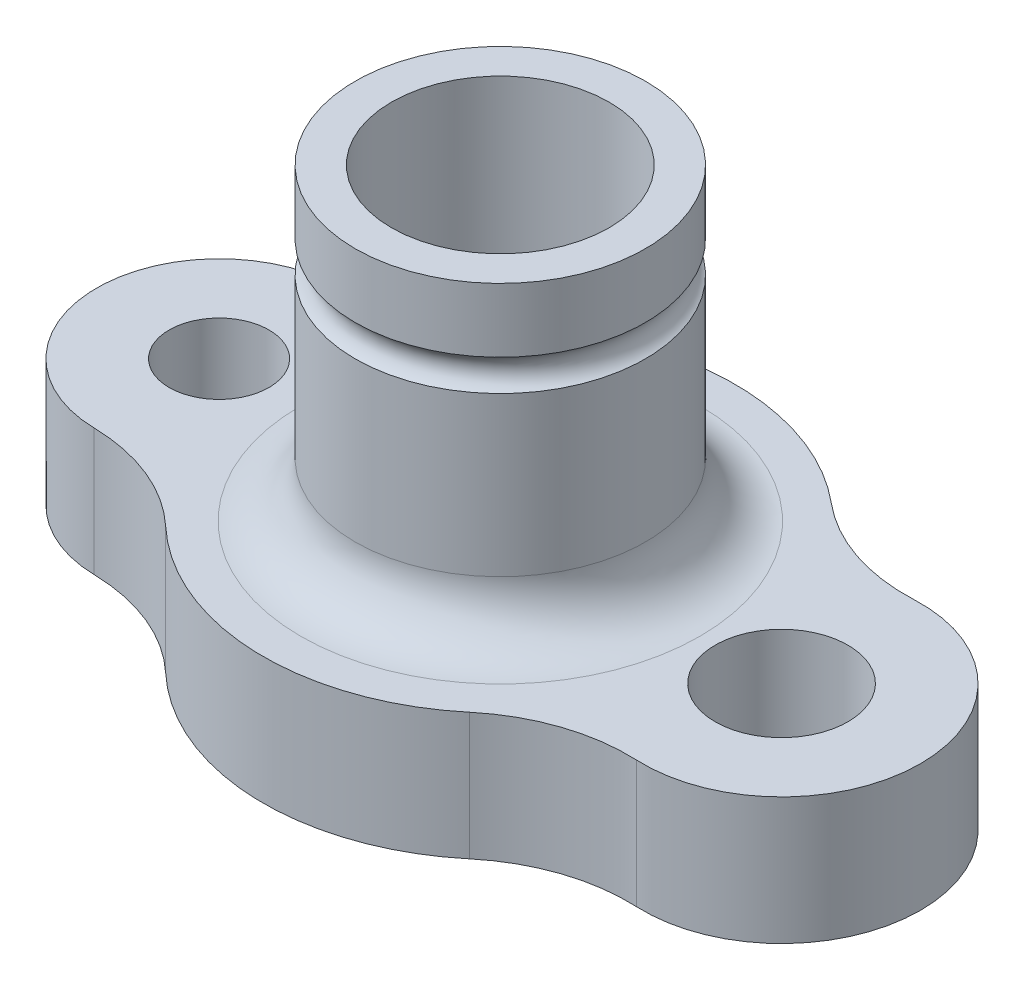
ISO-10303-21;
HEADER;
FILE_DESCRIPTION(('STEP AP214'),'2;1');
FILE_NAME('part.step','',(''),(''),'','','');
FILE_SCHEMA(('AUTOMOTIVE_DESIGN { 1 0 10303 214 1 1 1 1 }'));
ENDSEC;
DATA;
#1=APPLICATION_CONTEXT('core data for automotive mechanical design processes');
#2=APPLICATION_PROTOCOL_DEFINITION('international standard','automotive_design',2000,#1);
#3=PRODUCT_CONTEXT('',#1,'mechanical');
#4=PRODUCT('Part','Part','',(#3));
#5=PRODUCT_RELATED_PRODUCT_CATEGORY('part','',(#4));
#6=PRODUCT_DEFINITION_FORMATION('','',#4);
#7=PRODUCT_DEFINITION_CONTEXT('part definition',#1,'design');
#8=PRODUCT_DEFINITION('design','',#6,#7);
#9=PRODUCT_DEFINITION_SHAPE('','',#8);
#10=(LENGTH_UNIT() NAMED_UNIT(*) SI_UNIT(.MILLI.,.METRE.));
#11=(NAMED_UNIT(*) PLANE_ANGLE_UNIT() SI_UNIT($,.RADIAN.));
#12=(NAMED_UNIT(*) SI_UNIT($,.STERADIAN.) SOLID_ANGLE_UNIT());
#13=UNCERTAINTY_MEASURE_WITH_UNIT(LENGTH_MEASURE(1.E-05),#10,'distance_accuracy_value','');
#14=(GEOMETRIC_REPRESENTATION_CONTEXT(3) GLOBAL_UNCERTAINTY_ASSIGNED_CONTEXT((#13)) GLOBAL_UNIT_ASSIGNED_CONTEXT((#10,
#11,#12)) REPRESENTATION_CONTEXT('',''));
#15=CARTESIAN_POINT('',(0.,0.,0.));
#16=DIRECTION('',(0.,0.,1.));
#17=DIRECTION('',(1.,0.,0.));
#18=AXIS2_PLACEMENT_3D('',#15,#16,#17);
#19=CARTESIAN_POINT('',(0.,19.6088446071888,0.));
#20=DIRECTION('',(0.,-1.,0.));
#21=DIRECTION('',(0.,0.,-1.));
#22=AXIS2_PLACEMENT_3D('',#19,#20,#21);
#23=TOROIDAL_SURFACE('',#22,8.5,1.);
#24=CARTESIAN_POINT('',(0.,18.7428192034043,0.));
#25=DIRECTION('',(0.,1.,0.));
#26=DIRECTION('',(0.,0.,1.));
#27=AXIS2_PLACEMENT_3D('',#24,#25,#26);
#28=CIRCLE('',#27,8.);
#29=CARTESIAN_POINT('',(0.,18.7428192034043,8.));
#30=VERTEX_POINT('',#29);
#31=EDGE_CURVE('E11',#30,#30,#28,.F.);
#32=ORIENTED_EDGE('',*,*,#31,.F.);
#33=EDGE_LOOP('',(#32));
#34=FACE_BOUND('',#33,.T.);
#35=CARTESIAN_POINT('',(0.,20.4748700109732,0.));
#36=DIRECTION('',(0.,-1.,0.));
#37=DIRECTION('',(0.,0.,-1.));
#38=AXIS2_PLACEMENT_3D('',#35,#36,#37);
#39=CIRCLE('',#38,8.);
#40=CARTESIAN_POINT('',(0.,20.4748700109732,-8.));
#41=VERTEX_POINT('',#40);
#42=EDGE_CURVE('E48',#41,#41,#39,.F.);
#43=ORIENTED_EDGE('',*,*,#42,.F.);
#44=EDGE_LOOP('',(#43));
#45=FACE_BOUND('',#44,.T.);
#46=ADVANCED_FACE('F39',(#34,#45),#23,.F.);
#47=CARTESIAN_POINT('',(0.,7.,0.));
#48=DIRECTION('',(0.,-1.,0.));
#49=DIRECTION('',(0.,0.,-1.));
#50=AXIS2_PLACEMENT_3D('',#47,#48,#49);
#51=CYLINDRICAL_SURFACE('',#50,7.);
#52=CARTESIAN_POINT('',(0.,4.76393202250021,0.));
#53=DIRECTION('',(0.,1.,0.));
#54=DIRECTION('',(0.,0.,1.));
#55=AXIS2_PLACEMENT_3D('',#52,#53,#54);
#56=CIRCLE('',#55,7.);
#57=CARTESIAN_POINT('',(0.,4.76393202250021,7.));
#58=VERTEX_POINT('',#57);
#59=EDGE_CURVE('E187',#58,#58,#56,.T.);
#60=ORIENTED_EDGE('',*,*,#59,.T.);
#61=EDGE_LOOP('',(#60));
#62=FACE_BOUND('',#61,.T.);
#63=CARTESIAN_POINT('',(0.,0.,0.));
#64=DIRECTION('',(0.,1.,0.));
#65=DIRECTION('',(0.,0.,1.));
#66=AXIS2_PLACEMENT_3D('',#63,#64,#65);
#67=CIRCLE('',#66,7.);
#68=CARTESIAN_POINT('',(0.,0.,7.));
#69=VERTEX_POINT('',#68);
#70=EDGE_CURVE('E147',#69,#69,#67,.T.);
#71=ORIENTED_EDGE('',*,*,#70,.F.);
#72=EDGE_LOOP('',(#71));
#73=FACE_BOUND('',#72,.T.);
#74=ADVANCED_FACE('F214',(#62,#73),#51,.F.);
#75=CARTESIAN_POINT('',(0.,4.76393202250021,0.));
#76=DIRECTION('',(0.,1.,0.));
#77=DIRECTION('',(0.,0.,1.));
#78=AXIS2_PLACEMENT_3D('',#75,#76,#77);
#79=TOROIDAL_SURFACE('',#78,4.,3.);
#80=CARTESIAN_POINT('',(0.,6.42224441767791,0.));
#81=DIRECTION('',(0.,-1.,0.));
#82=DIRECTION('',(0.,0.,-1.));
#83=AXIS2_PLACEMENT_3D('',#80,#81,#82);
#84=CIRCLE('',#83,6.5);
#85=CARTESIAN_POINT('',(0.,6.42224441767791,-6.5));
#86=VERTEX_POINT('',#85);
#87=EDGE_CURVE('E199',#86,#86,#84,.F.);
#88=ORIENTED_EDGE('',*,*,#87,.T.);
#89=EDGE_LOOP('',(#88));
#90=FACE_BOUND('',#89,.T.);
#91=ORIENTED_EDGE('',*,*,#59,.F.);
#92=EDGE_LOOP('',(#91));
#93=FACE_BOUND('',#92,.T.);
#94=ADVANCED_FACE('F220',(#90,#93),#79,.F.);
#95=CARTESIAN_POINT('',(0.,8.08055681285561,0.));
#96=DIRECTION('',(0.,-1.,0.));
#97=DIRECTION('',(0.,0.,-1.));
#98=AXIS2_PLACEMENT_3D('',#95,#96,#97);
#99=TOROIDAL_SURFACE('',#98,9.,3.);
#100=CARTESIAN_POINT('',(0.,8.08055681285561,0.));
#101=DIRECTION('',(0.,-1.,0.));
#102=DIRECTION('',(0.,0.,-1.));
#103=AXIS2_PLACEMENT_3D('',#100,#101,#102);
#104=CIRCLE('',#103,6.);
#105=CARTESIAN_POINT('',(0.,8.08055681285561,-6.));
#106=VERTEX_POINT('',#105);
#107=EDGE_CURVE('E203',#106,#106,#104,.T.);
#108=ORIENTED_EDGE('',*,*,#107,.F.);
#109=EDGE_LOOP('',(#108));
#110=FACE_BOUND('',#109,.T.);
#111=ORIENTED_EDGE('',*,*,#87,.F.);
#112=EDGE_LOOP('',(#111));
#113=FACE_BOUND('',#112,.T.);
#114=ADVANCED_FACE('F251',(#110,#113),#99,.T.);
#115=CARTESIAN_POINT('',(0.,24.,0.));
#116=DIRECTION('',(0.,-1.,0.));
#117=DIRECTION('',(0.,0.,-1.));
#118=AXIS2_PLACEMENT_3D('',#115,#116,#117);
#119=CYLINDRICAL_SURFACE('',#118,6.);
#120=ORIENTED_EDGE('',*,*,#107,.T.);
#121=EDGE_LOOP('',(#120));
#122=FACE_BOUND('',#121,.T.);
#123=CARTESIAN_POINT('',(0.,24.,0.));
#124=DIRECTION('',(0.,1.,0.));
#125=DIRECTION('',(0.,0.,1.));
#126=AXIS2_PLACEMENT_3D('',#123,#124,#125);
#127=CIRCLE('',#126,6.);
#128=CARTESIAN_POINT('',(0.,24.,6.));
#129=VERTEX_POINT('',#128);
#130=EDGE_CURVE('E260',#129,#129,#127,.T.);
#131=ORIENTED_EDGE('',*,*,#130,.T.);
#132=EDGE_LOOP('',(#131));
#133=FACE_BOUND('',#132,.T.);
#134=ADVANCED_FACE('F246',(#122,#133),#119,.F.);
#135=CARTESIAN_POINT('',(0.,24.,0.));
#136=DIRECTION('',(0.,1.,0.));
#137=DIRECTION('',(0.,0.,1.));
#138=AXIS2_PLACEMENT_3D('',#135,#136,#137);
#139=PLANE('',#138);
#140=CARTESIAN_POINT('',(0.,24.,0.));
#141=DIRECTION('',(0.,1.,0.));
#142=DIRECTION('',(0.,0.,1.));
#143=AXIS2_PLACEMENT_3D('',#140,#141,#142);
#144=CIRCLE('',#143,8.);
#145=CARTESIAN_POINT('',(0.,24.,8.));
#146=VERTEX_POINT('',#145);
#147=EDGE_CURVE('E257',#146,#146,#144,.T.);
#148=ORIENTED_EDGE('',*,*,#147,.T.);
#149=EDGE_LOOP('',(#148));
#150=FACE_BOUND('',#149,.T.);
#151=ORIENTED_EDGE('',*,*,#130,.F.);
#152=EDGE_LOOP('',(#151));
#153=FACE_BOUND('',#152,.T.);
#154=ADVANCED_FACE('F238',(#150,#153),#139,.T.);
#155=CARTESIAN_POINT('',(0.,24.,0.));
#156=DIRECTION('',(0.,-1.,0.));
#157=DIRECTION('',(0.,0.,-1.));
#158=AXIS2_PLACEMENT_3D('',#155,#156,#157);
#159=CYLINDRICAL_SURFACE('',#158,8.);
#160=ORIENTED_EDGE('',*,*,#42,.T.);
#161=EDGE_LOOP('',(#160));
#162=FACE_BOUND('',#161,.T.);
#163=ORIENTED_EDGE('',*,*,#147,.F.);
#164=EDGE_LOOP('',(#163));
#165=FACE_BOUND('',#164,.T.);
#166=ADVANCED_FACE('F210',(#162,#165),#159,.T.);
#167=CARTESIAN_POINT('',(-15.6666732992892,0.,8.37334132896206));
#168=DIRECTION('',(0.,1.,0.));
#169=DIRECTION('',(0.,0.,1.));
#170=AXIS2_PLACEMENT_3D('',#167,#168,#169);
#171=PLANE('',#170);
#172=CARTESIAN_POINT('',(-15.8333465985785,0.,16.7466826579241));
#173=DIRECTION('',(0.,-1.,0.));
#174=DIRECTION('',(0.,0.,1.));
#175=AXIS2_PLACEMENT_3D('',#172,#173,#174);
#176=CIRCLE('',#175,10.);
#177=CARTESIAN_POINT('',(-15.6343337039048,0.,6.74866316065599));
#178=VERTEX_POINT('',#177);
#179=CARTESIAN_POINT('',(-8.97881406538982,0.,9.46551628491364));
#180=VERTEX_POINT('',#179);
#181=EDGE_CURVE('E142',#178,#180,#176,.T.);
#182=ORIENTED_EDGE('',*,*,#181,.F.);
#183=CARTESIAN_POINT('',(-15.5,0.,0.));
#184=DIRECTION('',(0.,1.,0.));
#185=DIRECTION('',(0.,0.,1.));
#186=AXIS2_PLACEMENT_3D('',#183,#184,#185);
#187=CIRCLE('',#186,6.75);
#188=CARTESIAN_POINT('',(-15.6343337039047,0.,-6.74866316065598));
#189=VERTEX_POINT('',#188);
#190=EDGE_CURVE('E91',#189,#178,#187,.T.);
#191=ORIENTED_EDGE('',*,*,#190,.F.);
#192=CARTESIAN_POINT('',(-15.8333465985785,0.,-16.7466826579241));
#193=DIRECTION('',(0.,-1.,0.));
#194=DIRECTION('',(0.,0.,-1.));
#195=AXIS2_PLACEMENT_3D('',#192,#193,#194);
#196=CIRCLE('',#195,10.);
#197=CARTESIAN_POINT('',(-8.97881406538982,0.,-9.46551628491363));
#198=VERTEX_POINT('',#197);
#199=EDGE_CURVE('E85',#198,#189,#196,.T.);
#200=ORIENTED_EDGE('',*,*,#199,.F.);
#201=CARTESIAN_POINT('',(-0.0679217722446071,0.,0.));
#202=DIRECTION('',(0.,1.,0.));
#203=DIRECTION('',(0.,0.,1.));
#204=AXIS2_PLACEMENT_3D('',#201,#202,#203);
#205=CIRCLE('',#204,13.);
#206=CARTESIAN_POINT('',(8.27332084725442,0.,-9.97114193874768));
#207=VERTEX_POINT('',#206);
#208=EDGE_CURVE('E129',#207,#198,#205,.T.);
#209=ORIENTED_EDGE('',*,*,#208,.F.);
#210=CARTESIAN_POINT('',(14.6896613237921,0.,-17.6412511223997));
#211=DIRECTION('',(0.,-1.,0.));
#212=DIRECTION('',(0.,0.,-1.));
#213=AXIS2_PLACEMENT_3D('',#210,#211,#212);
#214=CIRCLE('',#213,10.);
#215=CARTESIAN_POINT('',(15.148520579107,0.,-7.65178426055912));
#216=VERTEX_POINT('',#215);
#217=EDGE_CURVE('E156',#216,#207,#214,.T.);
#218=ORIENTED_EDGE('',*,*,#217,.F.);
#219=CARTESIAN_POINT('',(15.5,0.,0.));
#220=DIRECTION('',(0.,1.,0.));
#221=DIRECTION('',(0.,0.,1.));
#222=AXIS2_PLACEMENT_3D('',#219,#220,#221);
#223=CIRCLE('',#222,7.65985248901384);
#224=CARTESIAN_POINT('',(15.148520579107,0.,7.65178426055911));
#225=VERTEX_POINT('',#224);
#226=EDGE_CURVE('E153',#225,#216,#223,.T.);
#227=ORIENTED_EDGE('',*,*,#226,.F.);
#228=CARTESIAN_POINT('',(14.6896613237922,0.,17.6412511223997));
#229=DIRECTION('',(0.,-1.,0.));
#230=DIRECTION('',(0.,0.,-1.));
#231=AXIS2_PLACEMENT_3D('',#228,#229,#230);
#232=CIRCLE('',#231,10.);
#233=CARTESIAN_POINT('',(8.27332084725444,0.,9.97114193874768));
#234=VERTEX_POINT('',#233);
#235=EDGE_CURVE('E150',#234,#225,#232,.T.);
#236=ORIENTED_EDGE('',*,*,#235,.F.);
#237=CARTESIAN_POINT('',(-0.0679217722446071,0.,0.));
#238=DIRECTION('',(0.,1.,0.));
#239=DIRECTION('',(0.,0.,1.));
#240=AXIS2_PLACEMENT_3D('',#237,#238,#239);
#241=CIRCLE('',#240,13.);
#242=EDGE_CURVE('E146',#180,#234,#241,.T.);
#243=ORIENTED_EDGE('',*,*,#242,.F.);
#244=EDGE_LOOP('',(#182,#191,#200,#209,#218,#227,#236,#243));
#245=FACE_BOUND('',#244,.T.);
#246=ORIENTED_EDGE('',*,*,#70,.T.);
#247=EDGE_LOOP('',(#246));
#248=FACE_BOUND('',#247,.T.);
#249=CARTESIAN_POINT('',(-15.5,0.,0.));
#250=DIRECTION('',(0.,1.,0.));
#251=DIRECTION('',(0.,0.,1.));
#252=AXIS2_PLACEMENT_3D('',#249,#250,#251);
#253=CIRCLE('',#252,2.75);
#254=CARTESIAN_POINT('',(-15.5,0.,2.75));
#255=VERTEX_POINT('',#254);
#256=EDGE_CURVE('E272',#255,#255,#253,.T.);
#257=ORIENTED_EDGE('',*,*,#256,.T.);
#258=EDGE_LOOP('',(#257));
#259=FACE_BOUND('',#258,.T.);
#260=CARTESIAN_POINT('',(15.5,0.,0.));
#261=DIRECTION('',(0.,1.,0.));
#262=DIRECTION('',(0.,0.,1.));
#263=AXIS2_PLACEMENT_3D('',#260,#261,#262);
#264=CIRCLE('',#263,3.65985248901384);
#265=CARTESIAN_POINT('',(15.5,0.,3.65985248901384));
#266=VERTEX_POINT('',#265);
#267=EDGE_CURVE('E265',#266,#266,#264,.T.);
#268=ORIENTED_EDGE('',*,*,#267,.T.);
#269=EDGE_LOOP('',(#268));
#270=FACE_BOUND('',#269,.T.);
#271=ADVANCED_FACE('F237',(#245,#248,#259,#270),#171,.F.);
#272=CARTESIAN_POINT('',(15.5,7.,0.));
#273=DIRECTION('',(0.,-1.,0.));
#274=DIRECTION('',(0.,0.,-1.));
#275=AXIS2_PLACEMENT_3D('',#272,#273,#274);
#276=CYLINDRICAL_SURFACE('',#275,3.65985248901384);
#277=CARTESIAN_POINT('',(15.5,7.,0.));
#278=DIRECTION('',(0.,1.,0.));
#279=DIRECTION('',(0.,0.,1.));
#280=AXIS2_PLACEMENT_3D('',#277,#278,#279);
#281=CIRCLE('',#280,3.65985248901384);
#282=CARTESIAN_POINT('',(15.5,7.,3.65985248901384));
#283=VERTEX_POINT('',#282);
#284=EDGE_CURVE('E268',#283,#283,#281,.T.);
#285=ORIENTED_EDGE('',*,*,#284,.T.);
#286=EDGE_LOOP('',(#285));
#287=FACE_BOUND('',#286,.T.);
#288=ORIENTED_EDGE('',*,*,#267,.F.);
#289=EDGE_LOOP('',(#288));
#290=FACE_BOUND('',#289,.T.);
#291=ADVANCED_FACE('F243',(#287,#290),#276,.F.);
#292=CARTESIAN_POINT('',(-15.5,7.,0.));
#293=DIRECTION('',(0.,-1.,0.));
#294=DIRECTION('',(0.,0.,-1.));
#295=AXIS2_PLACEMENT_3D('',#292,#293,#294);
#296=CYLINDRICAL_SURFACE('',#295,6.75);
#297=ORIENTED_EDGE('',*,*,#190,.T.);
#298=DIRECTION('',(0.,-1.,0.));
#299=VECTOR('',#298,1.);
#300=CARTESIAN_POINT('',(-15.6343337039048,7.,6.74866316065599));
#301=LINE('',#300,#299);
#302=CARTESIAN_POINT('',(-15.6343337039048,7.,6.74866316065599));
#303=VERTEX_POINT('',#302);
#304=EDGE_CURVE('E138',#303,#178,#301,.T.);
#305=ORIENTED_EDGE('',*,*,#304,.F.);
#306=CARTESIAN_POINT('',(-15.5,7.,0.));
#307=DIRECTION('',(0.,1.,0.));
#308=DIRECTION('',(0.,0.,1.));
#309=AXIS2_PLACEMENT_3D('',#306,#307,#308);
#310=CIRCLE('',#309,6.75);
#311=CARTESIAN_POINT('',(-15.6343337039047,7.,-6.74866316065598));
#312=VERTEX_POINT('',#311);
#313=EDGE_CURVE('E56',#312,#303,#310,.T.);
#314=ORIENTED_EDGE('',*,*,#313,.F.);
#315=DIRECTION('',(0.,-1.,0.));
#316=VECTOR('',#315,1.);
#317=CARTESIAN_POINT('',(-15.6343337039047,7.,-6.74866316065598));
#318=LINE('',#317,#316);
#319=EDGE_CURVE('E132',#312,#189,#318,.T.);
#320=ORIENTED_EDGE('',*,*,#319,.T.);
#321=EDGE_LOOP('',(#297,#305,#314,#320));
#322=FACE_BOUND('',#321,.T.);
#323=ADVANCED_FACE('F313',(#322),#296,.T.);
#324=CARTESIAN_POINT('',(-15.8333465985785,7.,-16.7466826579241));
#325=DIRECTION('',(0.,-1.,0.));
#326=DIRECTION('',(0.,0.,-1.));
#327=AXIS2_PLACEMENT_3D('',#324,#325,#326);
#328=CYLINDRICAL_SURFACE('',#327,10.);
#329=ORIENTED_EDGE('',*,*,#199,.T.);
#330=ORIENTED_EDGE('',*,*,#319,.F.);
#331=CARTESIAN_POINT('',(-15.8333465985785,7.,-16.7466826579241));
#332=DIRECTION('',(0.,-1.,0.));
#333=DIRECTION('',(0.,0.,-1.));
#334=AXIS2_PLACEMENT_3D('',#331,#332,#333);
#335=CIRCLE('',#334,10.);
#336=CARTESIAN_POINT('',(-8.97881406538982,7.,-9.46551628491363));
#337=VERTEX_POINT('',#336);
#338=EDGE_CURVE('E118',#337,#312,#335,.T.);
#339=ORIENTED_EDGE('',*,*,#338,.F.);
#340=DIRECTION('',(0.,-1.,0.));
#341=VECTOR('',#340,1.);
#342=CARTESIAN_POINT('',(-8.97881406538982,7.,-9.46551628491363));
#343=LINE('',#342,#341);
#344=EDGE_CURVE('E126',#337,#198,#343,.T.);
#345=ORIENTED_EDGE('',*,*,#344,.T.);
#346=EDGE_LOOP('',(#329,#330,#339,#345));
#347=FACE_BOUND('',#346,.T.);
#348=ADVANCED_FACE('F134',(#347),#328,.F.);
#349=CARTESIAN_POINT('',(-0.0679217722446071,7.,0.));
#350=DIRECTION('',(0.,-1.,0.));
#351=DIRECTION('',(0.,0.,-1.));
#352=AXIS2_PLACEMENT_3D('',#349,#350,#351);
#353=CYLINDRICAL_SURFACE('',#352,13.);
#354=ORIENTED_EDGE('',*,*,#208,.T.);
#355=ORIENTED_EDGE('',*,*,#344,.F.);
#356=CARTESIAN_POINT('',(-0.0679217722446071,7.,0.));
#357=DIRECTION('',(0.,1.,0.));
#358=DIRECTION('',(0.,0.,1.));
#359=AXIS2_PLACEMENT_3D('',#356,#357,#358);
#360=CIRCLE('',#359,13.);
#361=CARTESIAN_POINT('',(8.27332084725442,7.,-9.97114193874768));
#362=VERTEX_POINT('',#361);
#363=EDGE_CURVE('E113',#362,#337,#360,.T.);
#364=ORIENTED_EDGE('',*,*,#363,.F.);
#365=DIRECTION('',(0.,-1.,0.));
#366=VECTOR('',#365,1.);
#367=CARTESIAN_POINT('',(8.27332084725442,7.,-9.97114193874768));
#368=LINE('',#367,#366);
#369=EDGE_CURVE('E131',#362,#207,#368,.T.);
#370=ORIENTED_EDGE('',*,*,#369,.T.);
#371=EDGE_LOOP('',(#354,#355,#364,#370));
#372=FACE_BOUND('',#371,.T.);
#373=ADVANCED_FACE('F127',(#372),#353,.T.);
#374=CARTESIAN_POINT('',(14.6896613237921,7.,-17.6412511223997));
#375=DIRECTION('',(0.,-1.,0.));
#376=DIRECTION('',(0.,0.,-1.));
#377=AXIS2_PLACEMENT_3D('',#374,#375,#376);
#378=CYLINDRICAL_SURFACE('',#377,10.);
#379=ORIENTED_EDGE('',*,*,#217,.T.);
#380=ORIENTED_EDGE('',*,*,#369,.F.);
#381=CARTESIAN_POINT('',(14.6896613237921,7.,-17.6412511223997));
#382=DIRECTION('',(0.,-1.,0.));
#383=DIRECTION('',(0.,0.,-1.));
#384=AXIS2_PLACEMENT_3D('',#381,#382,#383);
#385=CIRCLE('',#384,10.);
#386=CARTESIAN_POINT('',(15.148520579107,7.,-7.65178426055912));
#387=VERTEX_POINT('',#386);
#388=EDGE_CURVE('E120',#387,#362,#385,.T.);
#389=ORIENTED_EDGE('',*,*,#388,.F.);
#390=DIRECTION('',(0.,-1.,0.));
#391=VECTOR('',#390,1.);
#392=CARTESIAN_POINT('',(15.148520579107,7.,-7.65178426055912));
#393=LINE('',#392,#391);
#394=EDGE_CURVE('E172',#387,#216,#393,.T.);
#395=ORIENTED_EDGE('',*,*,#394,.T.);
#396=EDGE_LOOP('',(#379,#380,#389,#395));
#397=FACE_BOUND('',#396,.T.);
#398=ADVANCED_FACE('F305',(#397),#378,.F.);
#399=CARTESIAN_POINT('',(15.5,7.,0.));
#400=DIRECTION('',(0.,-1.,0.));
#401=DIRECTION('',(0.,0.,-1.));
#402=AXIS2_PLACEMENT_3D('',#399,#400,#401);
#403=CYLINDRICAL_SURFACE('',#402,7.65985248901384);
#404=ORIENTED_EDGE('',*,*,#226,.T.);
#405=ORIENTED_EDGE('',*,*,#394,.F.);
#406=CARTESIAN_POINT('',(15.5,7.,0.));
#407=DIRECTION('',(0.,1.,0.));
#408=DIRECTION('',(0.,0.,1.));
#409=AXIS2_PLACEMENT_3D('',#406,#407,#408);
#410=CIRCLE('',#409,7.65985248901384);
#411=CARTESIAN_POINT('',(15.148520579107,7.,7.65178426055911));
#412=VERTEX_POINT('',#411);
#413=EDGE_CURVE('E293',#412,#387,#410,.T.);
#414=ORIENTED_EDGE('',*,*,#413,.F.);
#415=DIRECTION('',(0.,-1.,0.));
#416=VECTOR('',#415,1.);
#417=CARTESIAN_POINT('',(15.148520579107,7.,7.65178426055911));
#418=LINE('',#417,#416);
#419=EDGE_CURVE('E176',#412,#225,#418,.T.);
#420=ORIENTED_EDGE('',*,*,#419,.T.);
#421=EDGE_LOOP('',(#404,#405,#414,#420));
#422=FACE_BOUND('',#421,.T.);
#423=ADVANCED_FACE('F301',(#422),#403,.T.);
#424=CARTESIAN_POINT('',(14.6896613237922,7.,17.6412511223997));
#425=DIRECTION('',(0.,-1.,0.));
#426=DIRECTION('',(0.,0.,-1.));
#427=AXIS2_PLACEMENT_3D('',#424,#425,#426);
#428=CYLINDRICAL_SURFACE('',#427,10.);
#429=ORIENTED_EDGE('',*,*,#235,.T.);
#430=ORIENTED_EDGE('',*,*,#419,.F.);
#431=CARTESIAN_POINT('',(14.6896613237922,7.,17.6412511223997));
#432=DIRECTION('',(0.,-1.,0.));
#433=DIRECTION('',(0.,0.,-1.));
#434=AXIS2_PLACEMENT_3D('',#431,#432,#433);
#435=CIRCLE('',#434,10.);
#436=CARTESIAN_POINT('',(8.27332084725444,7.,9.97114193874768));
#437=VERTEX_POINT('',#436);
#438=EDGE_CURVE('E290',#437,#412,#435,.T.);
#439=ORIENTED_EDGE('',*,*,#438,.F.);
#440=DIRECTION('',(0.,-1.,0.));
#441=VECTOR('',#440,1.);
#442=CARTESIAN_POINT('',(8.27332084725444,7.,9.97114193874768));
#443=LINE('',#442,#441);
#444=EDGE_CURVE('E180',#437,#234,#443,.T.);
#445=ORIENTED_EDGE('',*,*,#444,.T.);
#446=EDGE_LOOP('',(#429,#430,#439,#445));
#447=FACE_BOUND('',#446,.T.);
#448=ADVANCED_FACE('F330',(#447),#428,.F.);
#449=CARTESIAN_POINT('',(-0.0679217722446071,7.,0.));
#450=DIRECTION('',(0.,-1.,0.));
#451=DIRECTION('',(0.,0.,-1.));
#452=AXIS2_PLACEMENT_3D('',#449,#450,#451);
#453=CYLINDRICAL_SURFACE('',#452,13.);
#454=ORIENTED_EDGE('',*,*,#242,.T.);
#455=ORIENTED_EDGE('',*,*,#444,.F.);
#456=CARTESIAN_POINT('',(-0.0679217722446071,7.,0.));
#457=DIRECTION('',(0.,1.,0.));
#458=DIRECTION('',(0.,0.,1.));
#459=AXIS2_PLACEMENT_3D('',#456,#457,#458);
#460=CIRCLE('',#459,13.);
#461=CARTESIAN_POINT('',(-8.97881406538982,7.,9.46551628491364));
#462=VERTEX_POINT('',#461);
#463=EDGE_CURVE('E100',#462,#437,#460,.T.);
#464=ORIENTED_EDGE('',*,*,#463,.F.);
#465=DIRECTION('',(0.,-1.,0.));
#466=VECTOR('',#465,1.);
#467=CARTESIAN_POINT('',(-8.97881406538982,7.,9.46551628491364));
#468=LINE('',#467,#466);
#469=EDGE_CURVE('E184',#462,#180,#468,.T.);
#470=ORIENTED_EDGE('',*,*,#469,.T.);
#471=EDGE_LOOP('',(#454,#455,#464,#470));
#472=FACE_BOUND('',#471,.T.);
#473=ADVANCED_FACE('F333',(#472),#453,.T.);
#474=CARTESIAN_POINT('',(-15.8333465985785,7.,16.7466826579241));
#475=DIRECTION('',(0.,-1.,0.));
#476=DIRECTION('',(0.,0.,-1.));
#477=AXIS2_PLACEMENT_3D('',#474,#475,#476);
#478=CYLINDRICAL_SURFACE('',#477,10.);
#479=ORIENTED_EDGE('',*,*,#181,.T.);
#480=ORIENTED_EDGE('',*,*,#469,.F.);
#481=CARTESIAN_POINT('',(-15.8333465985785,7.,16.7466826579241));
#482=DIRECTION('',(0.,-1.,0.));
#483=DIRECTION('',(0.,0.,1.));
#484=AXIS2_PLACEMENT_3D('',#481,#482,#483);
#485=CIRCLE('',#484,10.);
#486=EDGE_CURVE('E165',#303,#462,#485,.T.);
#487=ORIENTED_EDGE('',*,*,#486,.F.);
#488=ORIENTED_EDGE('',*,*,#304,.T.);
#489=EDGE_LOOP('',(#479,#480,#487,#488));
#490=FACE_BOUND('',#489,.T.);
#491=ADVANCED_FACE('F311',(#490),#478,.F.);
#492=CARTESIAN_POINT('',(-15.5,7.,0.));
#493=DIRECTION('',(0.,-1.,0.));
#494=DIRECTION('',(0.,0.,-1.));
#495=AXIS2_PLACEMENT_3D('',#492,#493,#494);
#496=CYLINDRICAL_SURFACE('',#495,2.75);
#497=CARTESIAN_POINT('',(-15.5,7.,0.));
#498=DIRECTION('',(0.,1.,0.));
#499=DIRECTION('',(0.,0.,1.));
#500=AXIS2_PLACEMENT_3D('',#497,#498,#499);
#501=CIRCLE('',#500,2.75);
#502=CARTESIAN_POINT('',(-15.5,7.,2.75));
#503=VERTEX_POINT('',#502);
#504=EDGE_CURVE('E276',#503,#503,#501,.T.);
#505=ORIENTED_EDGE('',*,*,#504,.T.);
#506=EDGE_LOOP('',(#505));
#507=FACE_BOUND('',#506,.T.);
#508=ORIENTED_EDGE('',*,*,#256,.F.);
#509=EDGE_LOOP('',(#508));
#510=FACE_BOUND('',#509,.T.);
#511=ADVANCED_FACE('F339',(#507,#510),#496,.F.);
#512=CARTESIAN_POINT('',(-15.6666732992892,7.,8.37334132896206));
#513=DIRECTION('',(0.,1.,0.));
#514=DIRECTION('',(0.,0.,1.));
#515=AXIS2_PLACEMENT_3D('',#512,#513,#514);
#516=PLANE('',#515);
#517=CARTESIAN_POINT('',(0.,7.,0.));
#518=DIRECTION('',(0.,1.,0.));
#519=DIRECTION('',(0.,0.,1.));
#520=AXIS2_PLACEMENT_3D('',#517,#518,#519);
#521=CIRCLE('',#520,11.);
#522=CARTESIAN_POINT('',(0.,7.,11.));
#523=VERTEX_POINT('',#522);
#524=EDGE_CURVE('E195',#523,#523,#521,.F.);
#525=ORIENTED_EDGE('',*,*,#524,.T.);
#526=EDGE_LOOP('',(#525));
#527=FACE_BOUND('',#526,.T.);
#528=ORIENTED_EDGE('',*,*,#504,.F.);
#529=EDGE_LOOP('',(#528));
#530=FACE_BOUND('',#529,.T.);
#531=ORIENTED_EDGE('',*,*,#486,.T.);
#532=ORIENTED_EDGE('',*,*,#463,.T.);
#533=ORIENTED_EDGE('',*,*,#438,.T.);
#534=ORIENTED_EDGE('',*,*,#413,.T.);
#535=ORIENTED_EDGE('',*,*,#388,.T.);
#536=ORIENTED_EDGE('',*,*,#363,.T.);
#537=ORIENTED_EDGE('',*,*,#338,.T.);
#538=ORIENTED_EDGE('',*,*,#313,.T.);
#539=EDGE_LOOP('',(#531,#532,#533,#534,#535,#536,#537,#538));
#540=FACE_BOUND('',#539,.T.);
#541=ORIENTED_EDGE('',*,*,#284,.F.);
#542=EDGE_LOOP('',(#541));
#543=FACE_BOUND('',#542,.T.);
#544=ADVANCED_FACE('F115',(#527,#530,#540,#543),#516,.T.);
#545=CARTESIAN_POINT('',(0.,10.,0.));
#546=DIRECTION('',(0.,1.,0.));
#547=DIRECTION('',(0.,0.,1.));
#548=AXIS2_PLACEMENT_3D('',#545,#546,#547);
#549=TOROIDAL_SURFACE('',#548,11.,3.);
#550=ORIENTED_EDGE('',*,*,#524,.F.);
#551=EDGE_LOOP('',(#550));
#552=FACE_BOUND('',#551,.T.);
#553=CARTESIAN_POINT('',(0.,10.,0.));
#554=DIRECTION('',(0.,1.,0.));
#555=DIRECTION('',(0.,0.,1.));
#556=AXIS2_PLACEMENT_3D('',#553,#554,#555);
#557=CIRCLE('',#556,8.);
#558=CARTESIAN_POINT('',(0.,10.,8.));
#559=VERTEX_POINT('',#558);
#560=EDGE_CURVE('E191',#559,#559,#557,.T.);
#561=ORIENTED_EDGE('',*,*,#560,.F.);
#562=EDGE_LOOP('',(#561));
#563=FACE_BOUND('',#562,.T.);
#564=ADVANCED_FACE('F225',(#552,#563),#549,.F.);
#565=ORIENTED_EDGE('',*,*,#31,.T.);
#566=EDGE_LOOP('',(#565));
#567=FACE_BOUND('',#566,.T.);
#568=ORIENTED_EDGE('',*,*,#560,.T.);
#569=EDGE_LOOP('',(#568));
#570=FACE_BOUND('',#569,.T.);
#571=ADVANCED_FACE('F216',(#567,#570),#159,.T.);
#572=CLOSED_SHELL('',(#46,#74,#94,#114,#134,#154,#166,#271,#291,#323,#348,#373,#398,#423,#448,
#473,#491,#511,#544,#564,#571));
#573=MANIFOLD_SOLID_BREP('B2',#572);
#574=ADVANCED_BREP_SHAPE_REPRESENTATION('',(#18,#573),#14);
#575=SHAPE_DEFINITION_REPRESENTATION(#9,#574);
ENDSEC;
END-ISO-10303-21;
